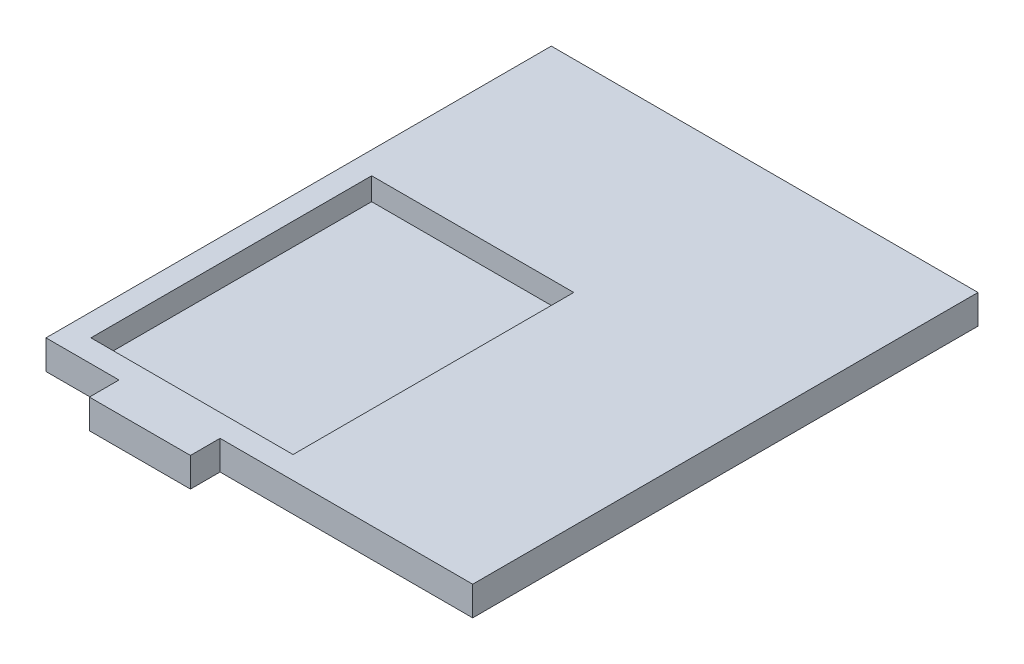
ISO-10303-21;
HEADER;
FILE_DESCRIPTION(('STEP AP214'),'2;1');
FILE_NAME('part.step','',(''),(''),'','','');
FILE_SCHEMA(('AUTOMOTIVE_DESIGN { 1 0 10303 214 1 1 1 1 }'));
ENDSEC;
DATA;
#1=APPLICATION_CONTEXT('core data for automotive mechanical design processes');
#2=APPLICATION_PROTOCOL_DEFINITION('international standard','automotive_design',2000,#1);
#3=PRODUCT_CONTEXT('',#1,'mechanical');
#4=PRODUCT('Part','Part','',(#3));
#5=PRODUCT_RELATED_PRODUCT_CATEGORY('part','',(#4));
#6=PRODUCT_DEFINITION_FORMATION('','',#4);
#7=PRODUCT_DEFINITION_CONTEXT('part definition',#1,'design');
#8=PRODUCT_DEFINITION('design','',#6,#7);
#9=PRODUCT_DEFINITION_SHAPE('','',#8);
#10=(LENGTH_UNIT() NAMED_UNIT(*) SI_UNIT(.MILLI.,.METRE.));
#11=(NAMED_UNIT(*) PLANE_ANGLE_UNIT() SI_UNIT($,.RADIAN.));
#12=(NAMED_UNIT(*) SI_UNIT($,.STERADIAN.) SOLID_ANGLE_UNIT());
#13=UNCERTAINTY_MEASURE_WITH_UNIT(LENGTH_MEASURE(1.E-05),#10,'distance_accuracy_value','');
#14=(GEOMETRIC_REPRESENTATION_CONTEXT(3) GLOBAL_UNCERTAINTY_ASSIGNED_CONTEXT((#13)) GLOBAL_UNIT_ASSIGNED_CONTEXT((#10,
#11,#12)) REPRESENTATION_CONTEXT('',''));
#15=CARTESIAN_POINT('',(0.,0.,0.));
#16=DIRECTION('',(0.,0.,1.));
#17=DIRECTION('',(1.,0.,0.));
#18=AXIS2_PLACEMENT_3D('',#15,#16,#17);
#19=CARTESIAN_POINT('',(0.,-3.,10.));
#20=DIRECTION('',(0.,0.,1.));
#21=DIRECTION('',(1.,0.,0.));
#22=AXIS2_PLACEMENT_3D('',#19,#20,#21);
#23=PLANE('',#22);
#24=DIRECTION('',(0.,1.,0.));
#25=VECTOR('',#24,1.);
#26=CARTESIAN_POINT('',(67.5,-3.,9.99999999999999));
#27=LINE('',#26,#25);
#28=CARTESIAN_POINT('',(67.5,-3.,10.));
#29=VERTEX_POINT('',#28);
#30=CARTESIAN_POINT('',(67.5,10.,10.));
#31=VERTEX_POINT('',#30);
#32=EDGE_CURVE('E12',#29,#31,#27,.T.);
#33=ORIENTED_EDGE('',*,*,#32,.F.);
#34=DIRECTION('',(1.,0.,0.));
#35=VECTOR('',#34,1.);
#36=CARTESIAN_POINT('',(0.,-3.,10.));
#37=LINE('',#36,#35);
#38=CARTESIAN_POINT('',(180.,-3.,10.));
#39=VERTEX_POINT('',#38);
#40=EDGE_CURVE('E251',#29,#39,#37,.T.);
#41=ORIENTED_EDGE('',*,*,#40,.T.);
#42=DIRECTION('',(0.,1.,0.));
#43=VECTOR('',#42,1.);
#44=CARTESIAN_POINT('',(180.,-3.,10.));
#45=LINE('',#44,#43);
#46=CARTESIAN_POINT('',(180.,10.,10.));
#47=VERTEX_POINT('',#46);
#48=EDGE_CURVE('E263',#39,#47,#45,.T.);
#49=ORIENTED_EDGE('',*,*,#48,.T.);
#50=DIRECTION('',(1.,0.,0.));
#51=VECTOR('',#50,1.);
#52=CARTESIAN_POINT('',(0.,10.,10.));
#53=LINE('',#52,#51);
#54=EDGE_CURVE('E311',#31,#47,#53,.T.);
#55=ORIENTED_EDGE('',*,*,#54,.F.);
#56=EDGE_LOOP('',(#33,#41,#49,#55));
#57=FACE_BOUND('',#56,.T.);
#58=ADVANCED_FACE('F165',(#57),#23,.T.);
#59=CARTESIAN_POINT('',(0.,-3.,-215.));
#60=DIRECTION('',(0.,0.,1.));
#61=DIRECTION('',(1.,0.,0.));
#62=AXIS2_PLACEMENT_3D('',#59,#60,#61);
#63=PLANE('',#62);
#64=DIRECTION('',(0.,1.,0.));
#65=VECTOR('',#64,1.);
#66=CARTESIAN_POINT('',(-10.,-3.,-215.));
#67=LINE('',#66,#65);
#68=CARTESIAN_POINT('',(-10.,-3.,-215.));
#69=VERTEX_POINT('',#68);
#70=CARTESIAN_POINT('',(-10.,10.,-215.));
#71=VERTEX_POINT('',#70);
#72=EDGE_CURVE('E234',#69,#71,#67,.T.);
#73=ORIENTED_EDGE('',*,*,#72,.T.);
#74=DIRECTION('',(1.,0.,0.));
#75=VECTOR('',#74,1.);
#76=CARTESIAN_POINT('',(0.,10.,-215.));
#77=LINE('',#76,#75);
#78=CARTESIAN_POINT('',(180.,10.,-215.));
#79=VERTEX_POINT('',#78);
#80=EDGE_CURVE('E321',#71,#79,#77,.T.);
#81=ORIENTED_EDGE('',*,*,#80,.T.);
#82=DIRECTION('',(0.,1.,0.));
#83=VECTOR('',#82,1.);
#84=CARTESIAN_POINT('',(180.,-3.,-215.));
#85=LINE('',#84,#83);
#86=CARTESIAN_POINT('',(180.,-3.,-215.));
#87=VERTEX_POINT('',#86);
#88=EDGE_CURVE('E237',#87,#79,#85,.T.);
#89=ORIENTED_EDGE('',*,*,#88,.F.);
#90=DIRECTION('',(1.,0.,0.));
#91=VECTOR('',#90,1.);
#92=CARTESIAN_POINT('',(0.,-3.,-215.));
#93=LINE('',#92,#91);
#94=EDGE_CURVE('E228',#69,#87,#93,.T.);
#95=ORIENTED_EDGE('',*,*,#94,.F.);
#96=EDGE_LOOP('',(#73,#81,#89,#95));
#97=FACE_BOUND('',#96,.T.);
#98=ADVANCED_FACE('F230',(#97),#63,.F.);
#99=CARTESIAN_POINT('',(180.,-3.,0.));
#100=DIRECTION('',(1.,0.,0.));
#101=DIRECTION('',(0.,0.,-1.));
#102=AXIS2_PLACEMENT_3D('',#99,#100,#101);
#103=PLANE('',#102);
#104=ORIENTED_EDGE('',*,*,#88,.T.);
#105=DIRECTION('',(0.,0.,-1.));
#106=VECTOR('',#105,1.);
#107=CARTESIAN_POINT('',(180.,10.,0.));
#108=LINE('',#107,#106);
#109=EDGE_CURVE('E314',#47,#79,#108,.T.);
#110=ORIENTED_EDGE('',*,*,#109,.F.);
#111=ORIENTED_EDGE('',*,*,#48,.F.);
#112=DIRECTION('',(0.,0.,-1.));
#113=VECTOR('',#112,1.);
#114=CARTESIAN_POINT('',(180.,-3.,0.));
#115=LINE('',#114,#113);
#116=EDGE_CURVE('E242',#39,#87,#115,.T.);
#117=ORIENTED_EDGE('',*,*,#116,.T.);
#118=EDGE_LOOP('',(#104,#110,#111,#117));
#119=FACE_BOUND('',#118,.T.);
#120=ADVANCED_FACE('F374',(#119),#103,.T.);
#121=CARTESIAN_POINT('',(-10.,-3.,10.));
#122=VERTEX_POINT('',#121);
#123=CARTESIAN_POINT('',(22.5,-3.,10.));
#124=VERTEX_POINT('',#123);
#125=EDGE_CURVE('E248',#122,#124,#37,.T.);
#126=ORIENTED_EDGE('',*,*,#125,.T.);
#127=DIRECTION('',(0.,1.,0.));
#128=VECTOR('',#127,1.);
#129=CARTESIAN_POINT('',(22.5,-3.,10.));
#130=LINE('',#129,#128);
#131=CARTESIAN_POINT('',(22.5,10.,10.));
#132=VERTEX_POINT('',#131);
#133=EDGE_CURVE('E175',#124,#132,#130,.T.);
#134=ORIENTED_EDGE('',*,*,#133,.T.);
#135=CARTESIAN_POINT('',(-10.,10.,10.));
#136=VERTEX_POINT('',#135);
#137=EDGE_CURVE('E316',#136,#132,#53,.T.);
#138=ORIENTED_EDGE('',*,*,#137,.F.);
#139=DIRECTION('',(0.,1.,0.));
#140=VECTOR('',#139,1.);
#141=CARTESIAN_POINT('',(-10.,-3.,10.));
#142=LINE('',#141,#140);
#143=EDGE_CURVE('E215',#122,#136,#142,.T.);
#144=ORIENTED_EDGE('',*,*,#143,.F.);
#145=EDGE_LOOP('',(#126,#134,#138,#144));
#146=FACE_BOUND('',#145,.T.);
#147=ADVANCED_FACE('F428',(#146),#23,.T.);
#148=CARTESIAN_POINT('',(-10.,-3.,0.));
#149=DIRECTION('',(1.,0.,0.));
#150=DIRECTION('',(0.,0.,-1.));
#151=AXIS2_PLACEMENT_3D('',#148,#149,#150);
#152=PLANE('',#151);
#153=ORIENTED_EDGE('',*,*,#143,.T.);
#154=DIRECTION('',(0.,0.,-1.));
#155=VECTOR('',#154,1.);
#156=CARTESIAN_POINT('',(-10.,10.,0.));
#157=LINE('',#156,#155);
#158=EDGE_CURVE('E256',#136,#71,#157,.T.);
#159=ORIENTED_EDGE('',*,*,#158,.T.);
#160=ORIENTED_EDGE('',*,*,#72,.F.);
#161=DIRECTION('',(0.,0.,-1.));
#162=VECTOR('',#161,1.);
#163=CARTESIAN_POINT('',(-10.,-3.,0.));
#164=LINE('',#163,#162);
#165=EDGE_CURVE('E245',#122,#69,#164,.T.);
#166=ORIENTED_EDGE('',*,*,#165,.F.);
#167=EDGE_LOOP('',(#153,#159,#160,#166));
#168=FACE_BOUND('',#167,.T.);
#169=ADVANCED_FACE('F254',(#168),#152,.F.);
#170=CARTESIAN_POINT('',(0.,-3.,0.));
#171=DIRECTION('',(0.,1.,0.));
#172=DIRECTION('',(0.,0.,1.));
#173=AXIS2_PLACEMENT_3D('',#170,#171,#172);
#174=PLANE('',#173);
#175=ORIENTED_EDGE('',*,*,#165,.T.);
#176=ORIENTED_EDGE('',*,*,#94,.T.);
#177=ORIENTED_EDGE('',*,*,#116,.F.);
#178=ORIENTED_EDGE('',*,*,#40,.F.);
#179=DIRECTION('',(0.,0.,1.));
#180=VECTOR('',#179,1.);
#181=CARTESIAN_POINT('',(67.5,-3.,9.99999999999999));
#182=LINE('',#181,#180);
#183=CARTESIAN_POINT('',(67.5,-3.,23.1836556320332));
#184=VERTEX_POINT('',#183);
#185=EDGE_CURVE('E275',#29,#184,#182,.T.);
#186=ORIENTED_EDGE('',*,*,#185,.T.);
#187=DIRECTION('',(1.,0.,0.));
#188=VECTOR('',#187,1.);
#189=CARTESIAN_POINT('',(22.5,-3.,23.1836556320332));
#190=LINE('',#189,#188);
#191=CARTESIAN_POINT('',(22.5,-3.,23.1836556320332));
#192=VERTEX_POINT('',#191);
#193=EDGE_CURVE('E272',#192,#184,#190,.T.);
#194=ORIENTED_EDGE('',*,*,#193,.F.);
#195=DIRECTION('',(0.,0.,1.));
#196=VECTOR('',#195,1.);
#197=CARTESIAN_POINT('',(22.5,-3.,10.));
#198=LINE('',#197,#196);
#199=EDGE_CURVE('E279',#124,#192,#198,.T.);
#200=ORIENTED_EDGE('',*,*,#199,.F.);
#201=ORIENTED_EDGE('',*,*,#125,.F.);
#202=EDGE_LOOP('',(#175,#176,#177,#178,#186,#194,#200,#201));
#203=FACE_BOUND('',#202,.T.);
#204=ADVANCED_FACE('F246',(#203),#174,.F.);
#205=CARTESIAN_POINT('',(22.5,-3.,10.));
#206=DIRECTION('',(-1.,0.,0.));
#207=DIRECTION('',(0.,0.,1.));
#208=AXIS2_PLACEMENT_3D('',#205,#206,#207);
#209=PLANE('',#208);
#210=DIRECTION('',(0.,1.,0.));
#211=VECTOR('',#210,1.);
#212=CARTESIAN_POINT('',(22.5,-3.,23.1836556320332));
#213=LINE('',#212,#211);
#214=CARTESIAN_POINT('',(22.5,10.,23.1836556320332));
#215=VERTEX_POINT('',#214);
#216=EDGE_CURVE('E206',#192,#215,#213,.T.);
#217=ORIENTED_EDGE('',*,*,#216,.T.);
#218=DIRECTION('',(0.,0.,1.));
#219=VECTOR('',#218,1.);
#220=CARTESIAN_POINT('',(22.5,10.,0.));
#221=LINE('',#220,#219);
#222=EDGE_CURVE('E305',#132,#215,#221,.T.);
#223=ORIENTED_EDGE('',*,*,#222,.F.);
#224=ORIENTED_EDGE('',*,*,#133,.F.);
#225=ORIENTED_EDGE('',*,*,#199,.T.);
#226=EDGE_LOOP('',(#217,#223,#224,#225));
#227=FACE_BOUND('',#226,.T.);
#228=ADVANCED_FACE('F429',(#227),#209,.T.);
#229=CARTESIAN_POINT('',(67.5,-3.,9.99999999999999));
#230=DIRECTION('',(-1.,0.,0.));
#231=DIRECTION('',(0.,0.,1.));
#232=AXIS2_PLACEMENT_3D('',#229,#230,#231);
#233=PLANE('',#232);
#234=ORIENTED_EDGE('',*,*,#32,.T.);
#235=DIRECTION('',(0.,0.,1.));
#236=VECTOR('',#235,1.);
#237=CARTESIAN_POINT('',(67.5,10.,0.));
#238=LINE('',#237,#236);
#239=CARTESIAN_POINT('',(67.5,10.,23.1836556320332));
#240=VERTEX_POINT('',#239);
#241=EDGE_CURVE('E303',#31,#240,#238,.T.);
#242=ORIENTED_EDGE('',*,*,#241,.T.);
#243=DIRECTION('',(0.,1.,0.));
#244=VECTOR('',#243,1.);
#245=CARTESIAN_POINT('',(67.5,-3.,23.1836556320332));
#246=LINE('',#245,#244);
#247=EDGE_CURVE('E169',#184,#240,#246,.T.);
#248=ORIENTED_EDGE('',*,*,#247,.F.);
#249=ORIENTED_EDGE('',*,*,#185,.F.);
#250=EDGE_LOOP('',(#234,#242,#248,#249));
#251=FACE_BOUND('',#250,.T.);
#252=ADVANCED_FACE('F309',(#251),#233,.F.);
#253=CARTESIAN_POINT('',(22.5,-3.,23.1836556320332));
#254=DIRECTION('',(0.,0.,1.));
#255=DIRECTION('',(1.,0.,0.));
#256=AXIS2_PLACEMENT_3D('',#253,#254,#255);
#257=PLANE('',#256);
#258=ORIENTED_EDGE('',*,*,#247,.T.);
#259=DIRECTION('',(1.,0.,0.));
#260=VECTOR('',#259,1.);
#261=CARTESIAN_POINT('',(0.,10.,23.1836556320332));
#262=LINE('',#261,#260);
#263=EDGE_CURVE('E293',#215,#240,#262,.T.);
#264=ORIENTED_EDGE('',*,*,#263,.F.);
#265=ORIENTED_EDGE('',*,*,#216,.F.);
#266=ORIENTED_EDGE('',*,*,#193,.T.);
#267=EDGE_LOOP('',(#258,#264,#265,#266));
#268=FACE_BOUND('',#267,.T.);
#269=ADVANCED_FACE('F167',(#268),#257,.T.);
#270=CARTESIAN_POINT('',(90.,10.,0.));
#271=DIRECTION('',(-1.,0.,0.));
#272=DIRECTION('',(0.,0.,1.));
#273=AXIS2_PLACEMENT_3D('',#270,#271,#272);
#274=PLANE('',#273);
#275=DIRECTION('',(0.,0.,-1.));
#276=VECTOR('',#275,1.);
#277=CARTESIAN_POINT('',(90.,0.,0.));
#278=LINE('',#277,#276);
#279=CARTESIAN_POINT('',(90.,0.,0.));
#280=VERTEX_POINT('',#279);
#281=CARTESIAN_POINT('',(90.,0.,-125.));
#282=VERTEX_POINT('',#281);
#283=EDGE_CURVE('E182',#280,#282,#278,.T.);
#284=ORIENTED_EDGE('',*,*,#283,.F.);
#285=DIRECTION('',(0.,-1.,0.));
#286=VECTOR('',#285,1.);
#287=CARTESIAN_POINT('',(90.,10.,0.));
#288=LINE('',#287,#286);
#289=CARTESIAN_POINT('',(90.,10.,0.));
#290=VERTEX_POINT('',#289);
#291=EDGE_CURVE('E276',#290,#280,#288,.T.);
#292=ORIENTED_EDGE('',*,*,#291,.F.);
#293=DIRECTION('',(0.,0.,-1.));
#294=VECTOR('',#293,1.);
#295=CARTESIAN_POINT('',(90.,10.,0.));
#296=LINE('',#295,#294);
#297=CARTESIAN_POINT('',(90.,10.,-125.));
#298=VERTEX_POINT('',#297);
#299=EDGE_CURVE('E328',#290,#298,#296,.T.);
#300=ORIENTED_EDGE('',*,*,#299,.T.);
#301=DIRECTION('',(0.,-1.,0.));
#302=VECTOR('',#301,1.);
#303=CARTESIAN_POINT('',(90.,10.,-125.));
#304=LINE('',#303,#302);
#305=EDGE_CURVE('E344',#298,#282,#304,.T.);
#306=ORIENTED_EDGE('',*,*,#305,.T.);
#307=EDGE_LOOP('',(#284,#292,#300,#306));
#308=FACE_BOUND('',#307,.T.);
#309=ADVANCED_FACE('F404',(#308),#274,.T.);
#310=CARTESIAN_POINT('',(0.,10.,0.));
#311=DIRECTION('',(0.,0.,-1.));
#312=DIRECTION('',(-1.,0.,0.));
#313=AXIS2_PLACEMENT_3D('',#310,#311,#312);
#314=PLANE('',#313);
#315=DIRECTION('',(1.,0.,0.));
#316=VECTOR('',#315,1.);
#317=CARTESIAN_POINT('',(0.,0.,0.));
#318=LINE('',#317,#316);
#319=CARTESIAN_POINT('',(0.,0.,0.));
#320=VERTEX_POINT('',#319);
#321=EDGE_CURVE('E347',#320,#280,#318,.T.);
#322=ORIENTED_EDGE('',*,*,#321,.F.);
#323=DIRECTION('',(0.,-1.,0.));
#324=VECTOR('',#323,1.);
#325=CARTESIAN_POINT('',(0.,10.,0.));
#326=LINE('',#325,#324);
#327=CARTESIAN_POINT('',(0.,10.,0.));
#328=VERTEX_POINT('',#327);
#329=EDGE_CURVE('E364',#328,#320,#326,.T.);
#330=ORIENTED_EDGE('',*,*,#329,.F.);
#331=DIRECTION('',(1.,0.,0.));
#332=VECTOR('',#331,1.);
#333=CARTESIAN_POINT('',(0.,10.,0.));
#334=LINE('',#333,#332);
#335=EDGE_CURVE('E332',#328,#290,#334,.T.);
#336=ORIENTED_EDGE('',*,*,#335,.T.);
#337=ORIENTED_EDGE('',*,*,#291,.T.);
#338=EDGE_LOOP('',(#322,#330,#336,#337));
#339=FACE_BOUND('',#338,.T.);
#340=ADVANCED_FACE('F413',(#339),#314,.T.);
#341=CARTESIAN_POINT('',(0.,10.,0.));
#342=DIRECTION('',(-1.,0.,0.));
#343=DIRECTION('',(0.,0.,1.));
#344=AXIS2_PLACEMENT_3D('',#341,#342,#343);
#345=PLANE('',#344);
#346=DIRECTION('',(0.,0.,-1.));
#347=VECTOR('',#346,1.);
#348=CARTESIAN_POINT('',(0.,0.,0.));
#349=LINE('',#348,#347);
#350=CARTESIAN_POINT('',(0.,0.,-125.));
#351=VERTEX_POINT('',#350);
#352=EDGE_CURVE('E351',#320,#351,#349,.T.);
#353=ORIENTED_EDGE('',*,*,#352,.T.);
#354=DIRECTION('',(0.,-1.,0.));
#355=VECTOR('',#354,1.);
#356=CARTESIAN_POINT('',(0.,10.,-125.));
#357=LINE('',#356,#355);
#358=CARTESIAN_POINT('',(0.,10.,-125.));
#359=VERTEX_POINT('',#358);
#360=EDGE_CURVE('E360',#359,#351,#357,.T.);
#361=ORIENTED_EDGE('',*,*,#360,.F.);
#362=DIRECTION('',(0.,0.,-1.));
#363=VECTOR('',#362,1.);
#364=CARTESIAN_POINT('',(0.,10.,0.));
#365=LINE('',#364,#363);
#366=EDGE_CURVE('E336',#328,#359,#365,.T.);
#367=ORIENTED_EDGE('',*,*,#366,.F.);
#368=ORIENTED_EDGE('',*,*,#329,.T.);
#369=EDGE_LOOP('',(#353,#361,#367,#368));
#370=FACE_BOUND('',#369,.T.);
#371=ADVANCED_FACE('F417',(#370),#345,.F.);
#372=CARTESIAN_POINT('',(0.,10.,-125.));
#373=DIRECTION('',(0.,0.,-1.));
#374=DIRECTION('',(-1.,0.,0.));
#375=AXIS2_PLACEMENT_3D('',#372,#373,#374);
#376=PLANE('',#375);
#377=DIRECTION('',(1.,0.,0.));
#378=VECTOR('',#377,1.);
#379=CARTESIAN_POINT('',(0.,0.,-125.));
#380=LINE('',#379,#378);
#381=EDGE_CURVE('E307',#351,#282,#380,.T.);
#382=ORIENTED_EDGE('',*,*,#381,.T.);
#383=ORIENTED_EDGE('',*,*,#305,.F.);
#384=DIRECTION('',(1.,0.,0.));
#385=VECTOR('',#384,1.);
#386=CARTESIAN_POINT('',(0.,10.,-125.));
#387=LINE('',#386,#385);
#388=EDGE_CURVE('E340',#359,#298,#387,.T.);
#389=ORIENTED_EDGE('',*,*,#388,.F.);
#390=ORIENTED_EDGE('',*,*,#360,.T.);
#391=EDGE_LOOP('',(#382,#383,#389,#390));
#392=FACE_BOUND('',#391,.T.);
#393=ADVANCED_FACE('F407',(#392),#376,.F.);
#394=CARTESIAN_POINT('',(0.,10.,0.));
#395=DIRECTION('',(0.,1.,0.));
#396=DIRECTION('',(0.,0.,1.));
#397=AXIS2_PLACEMENT_3D('',#394,#395,#396);
#398=PLANE('',#397);
#399=ORIENTED_EDGE('',*,*,#263,.T.);
#400=ORIENTED_EDGE('',*,*,#241,.F.);
#401=ORIENTED_EDGE('',*,*,#54,.T.);
#402=ORIENTED_EDGE('',*,*,#109,.T.);
#403=ORIENTED_EDGE('',*,*,#80,.F.);
#404=ORIENTED_EDGE('',*,*,#158,.F.);
#405=ORIENTED_EDGE('',*,*,#137,.T.);
#406=ORIENTED_EDGE('',*,*,#222,.T.);
#407=EDGE_LOOP('',(#399,#400,#401,#402,#403,#404,#405,#406));
#408=FACE_BOUND('',#407,.T.);
#409=ORIENTED_EDGE('',*,*,#299,.F.);
#410=ORIENTED_EDGE('',*,*,#335,.F.);
#411=ORIENTED_EDGE('',*,*,#366,.T.);
#412=ORIENTED_EDGE('',*,*,#388,.T.);
#413=EDGE_LOOP('',(#409,#410,#411,#412));
#414=FACE_BOUND('',#413,.T.);
#415=ADVANCED_FACE('F300',(#408,#414),#398,.T.);
#416=CARTESIAN_POINT('',(0.,0.,0.));
#417=DIRECTION('',(0.,1.,0.));
#418=DIRECTION('',(0.,0.,1.));
#419=AXIS2_PLACEMENT_3D('',#416,#417,#418);
#420=PLANE('',#419);
#421=ORIENTED_EDGE('',*,*,#321,.T.);
#422=ORIENTED_EDGE('',*,*,#283,.T.);
#423=ORIENTED_EDGE('',*,*,#381,.F.);
#424=ORIENTED_EDGE('',*,*,#352,.F.);
#425=EDGE_LOOP('',(#421,#422,#423,#424));
#426=FACE_BOUND('',#425,.T.);
#427=ADVANCED_FACE('F410',(#426),#420,.T.);
#428=CLOSED_SHELL('',(#58,#98,#120,#147,#169,#204,#228,#252,#269,#309,#340,#371,#393,#415,#427));
#429=MANIFOLD_SOLID_BREP('B2',#428);
#430=ADVANCED_BREP_SHAPE_REPRESENTATION('',(#18,#429),#14);
#431=SHAPE_DEFINITION_REPRESENTATION(#9,#430);
ENDSEC;
END-ISO-10303-21;
